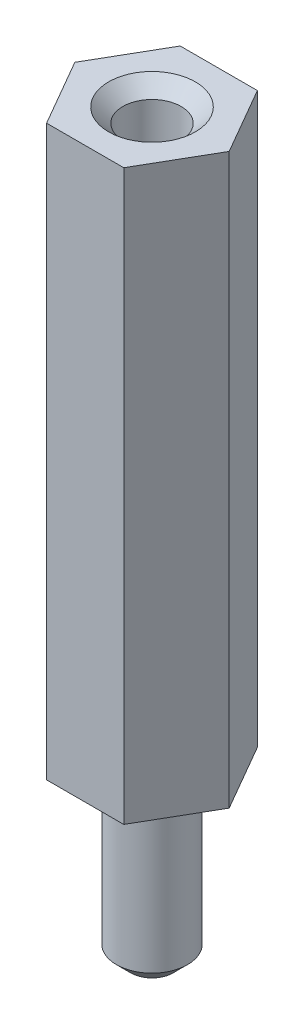
ISO-10303-21;
HEADER;
FILE_DESCRIPTION(('STEP AP214'),'2;1');
FILE_NAME('part.step','',(''),(''),'','','');
FILE_SCHEMA(('AUTOMOTIVE_DESIGN { 1 0 10303 214 1 1 1 1 }'));
ENDSEC;
DATA;
#1=APPLICATION_CONTEXT('core data for automotive mechanical design processes');
#2=APPLICATION_PROTOCOL_DEFINITION('international standard','automotive_design',2000,#1);
#3=PRODUCT_CONTEXT('',#1,'mechanical');
#4=PRODUCT('Part','Part','',(#3));
#5=PRODUCT_RELATED_PRODUCT_CATEGORY('part','',(#4));
#6=PRODUCT_DEFINITION_FORMATION('','',#4);
#7=PRODUCT_DEFINITION_CONTEXT('part definition',#1,'design');
#8=PRODUCT_DEFINITION('design','',#6,#7);
#9=PRODUCT_DEFINITION_SHAPE('','',#8);
#10=(LENGTH_UNIT() NAMED_UNIT(*) SI_UNIT(.MILLI.,.METRE.));
#11=(NAMED_UNIT(*) PLANE_ANGLE_UNIT() SI_UNIT($,.RADIAN.));
#12=(NAMED_UNIT(*) SI_UNIT($,.STERADIAN.) SOLID_ANGLE_UNIT());
#13=UNCERTAINTY_MEASURE_WITH_UNIT(LENGTH_MEASURE(1.E-05),#10,'distance_accuracy_value','');
#14=(GEOMETRIC_REPRESENTATION_CONTEXT(3) GLOBAL_UNCERTAINTY_ASSIGNED_CONTEXT((#13)) GLOBAL_UNIT_ASSIGNED_CONTEXT((#10,
#11,#12)) REPRESENTATION_CONTEXT('',''));
#15=CARTESIAN_POINT('',(0.,0.,0.));
#16=DIRECTION('',(0.,0.,1.));
#17=DIRECTION('',(1.,0.,0.));
#18=AXIS2_PLACEMENT_3D('',#15,#16,#17);
#19=CARTESIAN_POINT('',(-1.35677313259562,0.,2.35));
#20=DIRECTION('',(0.,0.,1.));
#21=DIRECTION('',(1.,0.,0.));
#22=AXIS2_PLACEMENT_3D('',#19,#20,#21);
#23=PLANE('',#22);
#24=DIRECTION('',(1.,0.,0.));
#25=VECTOR('',#24,1.);
#26=CARTESIAN_POINT('',(-1.35677313259562,20.,2.35));
#27=LINE('',#26,#25);
#28=CARTESIAN_POINT('',(-1.35677313259562,20.,2.35));
#29=VERTEX_POINT('',#28);
#30=CARTESIAN_POINT('',(1.35677313259562,20.,2.35));
#31=VERTEX_POINT('',#30);
#32=EDGE_CURVE('E124',#29,#31,#27,.T.);
#33=ORIENTED_EDGE('',*,*,#32,.F.);
#34=DIRECTION('',(0.,1.,0.));
#35=VECTOR('',#34,1.);
#36=CARTESIAN_POINT('',(-1.35677313259562,0.,2.35));
#37=LINE('',#36,#35);
#38=CARTESIAN_POINT('',(-1.35677313259562,0.,2.35));
#39=VERTEX_POINT('',#38);
#40=EDGE_CURVE('E53',#39,#29,#37,.T.);
#41=ORIENTED_EDGE('',*,*,#40,.F.);
#42=DIRECTION('',(1.,0.,0.));
#43=VECTOR('',#42,1.);
#44=CARTESIAN_POINT('',(-1.35677313259562,0.,2.35));
#45=LINE('',#44,#43);
#46=CARTESIAN_POINT('',(1.35677313259562,0.,2.35));
#47=VERTEX_POINT('',#46);
#48=EDGE_CURVE('E140',#39,#47,#45,.T.);
#49=ORIENTED_EDGE('',*,*,#48,.T.);
#50=DIRECTION('',(0.,1.,0.));
#51=VECTOR('',#50,1.);
#52=CARTESIAN_POINT('',(1.35677313259562,0.,2.35));
#53=LINE('',#52,#51);
#54=EDGE_CURVE('E88',#47,#31,#53,.T.);
#55=ORIENTED_EDGE('',*,*,#54,.T.);
#56=EDGE_LOOP('',(#33,#41,#49,#55));
#57=FACE_BOUND('',#56,.T.);
#58=ADVANCED_FACE('F35',(#57),#23,.T.);
#59=CARTESIAN_POINT('',(-2.71354626519124,0.,0.));
#60=DIRECTION('',(-0.866025403784439,0.,0.5));
#61=DIRECTION('',(0.5,0.,0.866025403784439));
#62=AXIS2_PLACEMENT_3D('',#59,#60,#61);
#63=PLANE('',#62);
#64=DIRECTION('',(0.5,0.,0.866025403784438));
#65=VECTOR('',#64,1.);
#66=CARTESIAN_POINT('',(-2.71354626519124,20.,0.));
#67=LINE('',#66,#65);
#68=CARTESIAN_POINT('',(-2.71354626519124,20.,0.));
#69=VERTEX_POINT('',#68);
#70=EDGE_CURVE('E137',#69,#29,#67,.T.);
#71=ORIENTED_EDGE('',*,*,#70,.F.);
#72=DIRECTION('',(0.,1.,0.));
#73=VECTOR('',#72,1.);
#74=CARTESIAN_POINT('',(-2.71354626519124,0.,0.));
#75=LINE('',#74,#73);
#76=CARTESIAN_POINT('',(-2.71354626519124,0.,0.));
#77=VERTEX_POINT('',#76);
#78=EDGE_CURVE('E76',#77,#69,#75,.T.);
#79=ORIENTED_EDGE('',*,*,#78,.F.);
#80=DIRECTION('',(0.5,0.,0.866025403784438));
#81=VECTOR('',#80,1.);
#82=CARTESIAN_POINT('',(-2.71354626519124,0.,0.));
#83=LINE('',#82,#81);
#84=EDGE_CURVE('E114',#77,#39,#83,.T.);
#85=ORIENTED_EDGE('',*,*,#84,.T.);
#86=ORIENTED_EDGE('',*,*,#40,.T.);
#87=EDGE_LOOP('',(#71,#79,#85,#86));
#88=FACE_BOUND('',#87,.T.);
#89=ADVANCED_FACE('F167',(#88),#63,.T.);
#90=CARTESIAN_POINT('',(-1.35677313259562,0.,-2.35));
#91=DIRECTION('',(-0.866025403784438,0.,-0.5));
#92=DIRECTION('',(-0.5,0.,0.866025403784438));
#93=AXIS2_PLACEMENT_3D('',#90,#91,#92);
#94=PLANE('',#93);
#95=DIRECTION('',(-0.5,0.,0.866025403784438));
#96=VECTOR('',#95,1.);
#97=CARTESIAN_POINT('',(-1.35677313259562,20.,-2.35));
#98=LINE('',#97,#96);
#99=CARTESIAN_POINT('',(-1.35677313259562,20.,-2.35));
#100=VERTEX_POINT('',#99);
#101=EDGE_CURVE('E101',#100,#69,#98,.T.);
#102=ORIENTED_EDGE('',*,*,#101,.F.);
#103=DIRECTION('',(0.,1.,0.));
#104=VECTOR('',#103,1.);
#105=CARTESIAN_POINT('',(-1.35677313259562,0.,-2.35));
#106=LINE('',#105,#104);
#107=CARTESIAN_POINT('',(-1.35677313259562,0.,-2.35));
#108=VERTEX_POINT('',#107);
#109=EDGE_CURVE('E96',#108,#100,#106,.T.);
#110=ORIENTED_EDGE('',*,*,#109,.F.);
#111=DIRECTION('',(-0.5,0.,0.866025403784438));
#112=VECTOR('',#111,1.);
#113=CARTESIAN_POINT('',(-1.35677313259562,0.,-2.35));
#114=LINE('',#113,#112);
#115=EDGE_CURVE('E99',#108,#77,#114,.T.);
#116=ORIENTED_EDGE('',*,*,#115,.T.);
#117=ORIENTED_EDGE('',*,*,#78,.T.);
#118=EDGE_LOOP('',(#102,#110,#116,#117));
#119=FACE_BOUND('',#118,.T.);
#120=ADVANCED_FACE('F98',(#119),#94,.T.);
#121=CARTESIAN_POINT('',(1.35677313259562,0.,-2.35));
#122=DIRECTION('',(0.,0.,-1.));
#123=DIRECTION('',(-1.,0.,0.));
#124=AXIS2_PLACEMENT_3D('',#121,#122,#123);
#125=PLANE('',#124);
#126=DIRECTION('',(-1.,0.,0.));
#127=VECTOR('',#126,1.);
#128=CARTESIAN_POINT('',(1.35677313259562,20.,-2.35));
#129=LINE('',#128,#127);
#130=CARTESIAN_POINT('',(1.35677313259562,20.,-2.35));
#131=VERTEX_POINT('',#130);
#132=EDGE_CURVE('E134',#131,#100,#129,.T.);
#133=ORIENTED_EDGE('',*,*,#132,.F.);
#134=DIRECTION('',(0.,1.,0.));
#135=VECTOR('',#134,1.);
#136=CARTESIAN_POINT('',(1.35677313259562,0.,-2.35));
#137=LINE('',#136,#135);
#138=CARTESIAN_POINT('',(1.35677313259562,0.,-2.35));
#139=VERTEX_POINT('',#138);
#140=EDGE_CURVE('E106',#139,#131,#137,.T.);
#141=ORIENTED_EDGE('',*,*,#140,.F.);
#142=DIRECTION('',(-1.,0.,0.));
#143=VECTOR('',#142,1.);
#144=CARTESIAN_POINT('',(1.35677313259562,0.,-2.35));
#145=LINE('',#144,#143);
#146=EDGE_CURVE('E112',#139,#108,#145,.T.);
#147=ORIENTED_EDGE('',*,*,#146,.T.);
#148=ORIENTED_EDGE('',*,*,#109,.T.);
#149=EDGE_LOOP('',(#133,#141,#147,#148));
#150=FACE_BOUND('',#149,.T.);
#151=ADVANCED_FACE('F116',(#150),#125,.T.);
#152=CARTESIAN_POINT('',(2.71354626519124,0.,0.));
#153=DIRECTION('',(0.866025403784438,0.,-0.5));
#154=DIRECTION('',(-0.5,0.,-0.866025403784439));
#155=AXIS2_PLACEMENT_3D('',#152,#153,#154);
#156=PLANE('',#155);
#157=DIRECTION('',(-0.5,0.,-0.866025403784438));
#158=VECTOR('',#157,1.);
#159=CARTESIAN_POINT('',(2.71354626519124,20.,0.));
#160=LINE('',#159,#158);
#161=CARTESIAN_POINT('',(2.71354626519124,20.,0.));
#162=VERTEX_POINT('',#161);
#163=EDGE_CURVE('E131',#162,#131,#160,.T.);
#164=ORIENTED_EDGE('',*,*,#163,.F.);
#165=DIRECTION('',(0.,1.,0.));
#166=VECTOR('',#165,1.);
#167=CARTESIAN_POINT('',(2.71354626519124,0.,0.));
#168=LINE('',#167,#166);
#169=CARTESIAN_POINT('',(2.71354626519124,0.,0.));
#170=VERTEX_POINT('',#169);
#171=EDGE_CURVE('E145',#170,#162,#168,.T.);
#172=ORIENTED_EDGE('',*,*,#171,.F.);
#173=DIRECTION('',(-0.5,0.,-0.866025403784438));
#174=VECTOR('',#173,1.);
#175=CARTESIAN_POINT('',(2.71354626519124,0.,0.));
#176=LINE('',#175,#174);
#177=EDGE_CURVE('E117',#170,#139,#176,.T.);
#178=ORIENTED_EDGE('',*,*,#177,.T.);
#179=ORIENTED_EDGE('',*,*,#140,.T.);
#180=EDGE_LOOP('',(#164,#172,#178,#179));
#181=FACE_BOUND('',#180,.T.);
#182=ADVANCED_FACE('F182',(#181),#156,.T.);
#183=CARTESIAN_POINT('',(1.35677313259562,0.,2.35));
#184=DIRECTION('',(0.866025403784438,0.,0.5));
#185=DIRECTION('',(0.5,0.,-0.866025403784438));
#186=AXIS2_PLACEMENT_3D('',#183,#184,#185);
#187=PLANE('',#186);
#188=DIRECTION('',(0.5,0.,-0.866025403784438));
#189=VECTOR('',#188,1.);
#190=CARTESIAN_POINT('',(1.35677313259562,20.,2.35));
#191=LINE('',#190,#189);
#192=EDGE_CURVE('E127',#31,#162,#191,.T.);
#193=ORIENTED_EDGE('',*,*,#192,.F.);
#194=ORIENTED_EDGE('',*,*,#54,.F.);
#195=DIRECTION('',(0.5,0.,-0.866025403784438));
#196=VECTOR('',#195,1.);
#197=CARTESIAN_POINT('',(1.35677313259562,0.,2.35));
#198=LINE('',#197,#196);
#199=EDGE_CURVE('E119',#47,#170,#198,.T.);
#200=ORIENTED_EDGE('',*,*,#199,.T.);
#201=ORIENTED_EDGE('',*,*,#171,.T.);
#202=EDGE_LOOP('',(#193,#194,#200,#201));
#203=FACE_BOUND('',#202,.T.);
#204=ADVANCED_FACE('F174',(#203),#187,.T.);
#205=CARTESIAN_POINT('',(0.,0.,0.));
#206=DIRECTION('',(0.,1.,0.));
#207=DIRECTION('',(0.,0.,1.));
#208=AXIS2_PLACEMENT_3D('',#205,#206,#207);
#209=PLANE('',#208);
#210=CARTESIAN_POINT('',(0.,0.,0.));
#211=DIRECTION('',(0.,1.,0.));
#212=DIRECTION('',(0.,0.,1.));
#213=AXIS2_PLACEMENT_3D('',#210,#211,#212);
#214=CIRCLE('',#213,1.25);
#215=CARTESIAN_POINT('',(0.,0.,1.25));
#216=VERTEX_POINT('',#215);
#217=EDGE_CURVE('E128',#216,#216,#214,.T.);
#218=ORIENTED_EDGE('',*,*,#217,.T.);
#219=EDGE_LOOP('',(#218));
#220=FACE_BOUND('',#219,.T.);
#221=ORIENTED_EDGE('',*,*,#48,.F.);
#222=ORIENTED_EDGE('',*,*,#84,.F.);
#223=ORIENTED_EDGE('',*,*,#115,.F.);
#224=ORIENTED_EDGE('',*,*,#146,.F.);
#225=ORIENTED_EDGE('',*,*,#177,.F.);
#226=ORIENTED_EDGE('',*,*,#199,.F.);
#227=EDGE_LOOP('',(#221,#222,#223,#224,#225,#226));
#228=FACE_BOUND('',#227,.T.);
#229=ADVANCED_FACE('F110',(#220,#228),#209,.F.);
#230=CARTESIAN_POINT('',(0.,20.,0.));
#231=DIRECTION('',(0.,1.,0.));
#232=DIRECTION('',(0.,0.,1.));
#233=AXIS2_PLACEMENT_3D('',#230,#231,#232);
#234=PLANE('',#233);
#235=CARTESIAN_POINT('',(0.,20.,0.));
#236=DIRECTION('',(0.,1.,0.));
#237=DIRECTION('',(0.,0.,1.));
#238=AXIS2_PLACEMENT_3D('',#235,#236,#237);
#239=CIRCLE('',#238,1.525);
#240=CARTESIAN_POINT('',(0.,20.,1.525));
#241=VERTEX_POINT('',#240);
#242=EDGE_CURVE('E11',#241,#241,#239,.F.);
#243=ORIENTED_EDGE('',*,*,#242,.T.);
#244=EDGE_LOOP('',(#243));
#245=FACE_BOUND('',#244,.T.);
#246=ORIENTED_EDGE('',*,*,#32,.T.);
#247=ORIENTED_EDGE('',*,*,#192,.T.);
#248=ORIENTED_EDGE('',*,*,#163,.T.);
#249=ORIENTED_EDGE('',*,*,#132,.T.);
#250=ORIENTED_EDGE('',*,*,#101,.T.);
#251=ORIENTED_EDGE('',*,*,#70,.T.);
#252=EDGE_LOOP('',(#246,#247,#248,#249,#250,#251));
#253=FACE_BOUND('',#252,.T.);
#254=ADVANCED_FACE('F190',(#245,#253),#234,.T.);
#255=CARTESIAN_POINT('',(0.,-6.,0.));
#256=DIRECTION('',(0.,1.,0.));
#257=DIRECTION('',(0.,0.,1.));
#258=AXIS2_PLACEMENT_3D('',#255,#256,#257);
#259=CYLINDRICAL_SURFACE('',#258,1.25);
#260=CARTESIAN_POINT('',(0.,-5.5,0.));
#261=DIRECTION('',(0.,-1.,0.));
#262=DIRECTION('',(0.,0.,-1.));
#263=AXIS2_PLACEMENT_3D('',#260,#261,#262);
#264=CIRCLE('',#263,1.25);
#265=CARTESIAN_POINT('',(0.,-5.5,-1.25));
#266=VERTEX_POINT('',#265);
#267=EDGE_CURVE('E142',#266,#266,#264,.F.);
#268=ORIENTED_EDGE('',*,*,#267,.T.);
#269=EDGE_LOOP('',(#268));
#270=FACE_BOUND('',#269,.T.);
#271=ORIENTED_EDGE('',*,*,#217,.F.);
#272=EDGE_LOOP('',(#271));
#273=FACE_BOUND('',#272,.T.);
#274=ADVANCED_FACE('F193',(#270,#273),#259,.T.);
#275=CARTESIAN_POINT('',(1.25,-6.,0.));
#276=DIRECTION('',(0.,-1.,0.));
#277=DIRECTION('',(0.,0.,-1.));
#278=AXIS2_PLACEMENT_3D('',#275,#276,#277);
#279=PLANE('',#278);
#280=CARTESIAN_POINT('',(0.,-6.,0.));
#281=DIRECTION('',(0.,-1.,0.));
#282=DIRECTION('',(0.,0.,-1.));
#283=AXIS2_PLACEMENT_3D('',#280,#281,#282);
#284=CIRCLE('',#283,0.749999999999994);
#285=CARTESIAN_POINT('',(0.,-6.,-0.749999999999994));
#286=VERTEX_POINT('',#285);
#287=EDGE_CURVE('E150',#286,#286,#284,.T.);
#288=ORIENTED_EDGE('',*,*,#287,.T.);
#289=EDGE_LOOP('',(#288));
#290=FACE_BOUND('',#289,.T.);
#291=ADVANCED_FACE('F200',(#290),#279,.T.);
#292=CARTESIAN_POINT('',(0.,1.,0.));
#293=DIRECTION('',(0.,-1.,0.));
#294=DIRECTION('',(0.,0.,-1.));
#295=AXIS2_PLACEMENT_3D('',#292,#293,#294);
#296=PLANE('',#295);
#297=CARTESIAN_POINT('',(0.,1.,0.));
#298=DIRECTION('',(0.,1.,0.));
#299=DIRECTION('',(0.,0.,1.));
#300=AXIS2_PLACEMENT_3D('',#297,#298,#299);
#301=CIRCLE('',#300,1.025);
#302=CARTESIAN_POINT('',(0.,1.,1.025));
#303=VERTEX_POINT('',#302);
#304=EDGE_CURVE('E292',#303,#303,#301,.T.);
#305=ORIENTED_EDGE('',*,*,#304,.T.);
#306=EDGE_LOOP('',(#305));
#307=FACE_BOUND('',#306,.T.);
#308=ADVANCED_FACE('F204',(#307),#296,.F.);
#309=CARTESIAN_POINT('',(0.,20.,0.));
#310=DIRECTION('',(0.,1.,0.));
#311=DIRECTION('',(0.,0.,1.));
#312=AXIS2_PLACEMENT_3D('',#309,#310,#311);
#313=CYLINDRICAL_SURFACE('',#312,1.025);
#314=CARTESIAN_POINT('',(0.,19.5,0.));
#315=DIRECTION('',(0.,1.,0.));
#316=DIRECTION('',(0.,0.,1.));
#317=AXIS2_PLACEMENT_3D('',#314,#315,#316);
#318=CIRCLE('',#317,1.025);
#319=CARTESIAN_POINT('',(0.,19.5,1.025));
#320=VERTEX_POINT('',#319);
#321=EDGE_CURVE('E45',#320,#320,#318,.T.);
#322=ORIENTED_EDGE('',*,*,#321,.T.);
#323=EDGE_LOOP('',(#322));
#324=FACE_BOUND('',#323,.T.);
#325=ORIENTED_EDGE('',*,*,#304,.F.);
#326=EDGE_LOOP('',(#325));
#327=FACE_BOUND('',#326,.T.);
#328=ADVANCED_FACE('F155',(#324,#327),#313,.F.);
#329=CARTESIAN_POINT('',(0.,-5.5,0.));
#330=DIRECTION('',(0.,1.,0.));
#331=DIRECTION('',(0.,0.,1.));
#332=AXIS2_PLACEMENT_3D('',#329,#330,#331);
#333=CONICAL_SURFACE('',#332,1.25,0.785398163397454);
#334=ORIENTED_EDGE('',*,*,#287,.F.);
#335=EDGE_LOOP('',(#334));
#336=FACE_BOUND('',#335,.T.);
#337=ORIENTED_EDGE('',*,*,#267,.F.);
#338=EDGE_LOOP('',(#337));
#339=FACE_BOUND('',#338,.T.);
#340=ADVANCED_FACE('F159',(#336,#339),#333,.T.);
#341=CARTESIAN_POINT('',(0.,19.5,0.));
#342=DIRECTION('',(0.,1.,0.));
#343=DIRECTION('',(0.,0.,1.));
#344=AXIS2_PLACEMENT_3D('',#341,#342,#343);
#345=CONICAL_SURFACE('',#344,1.025,0.785398163397455);
#346=ORIENTED_EDGE('',*,*,#242,.F.);
#347=EDGE_LOOP('',(#346));
#348=FACE_BOUND('',#347,.T.);
#349=ORIENTED_EDGE('',*,*,#321,.F.);
#350=EDGE_LOOP('',(#349));
#351=FACE_BOUND('',#350,.T.);
#352=ADVANCED_FACE('F38',(#348,#351),#345,.F.);
#353=CLOSED_SHELL('',(#58,#89,#120,#151,#182,#204,#229,#254,#274,#291,#308,#328,#340,#352));
#354=MANIFOLD_SOLID_BREP('B2',#353);
#355=ADVANCED_BREP_SHAPE_REPRESENTATION('',(#18,#354),#14);
#356=SHAPE_DEFINITION_REPRESENTATION(#9,#355);
ENDSEC;
END-ISO-10303-21;
